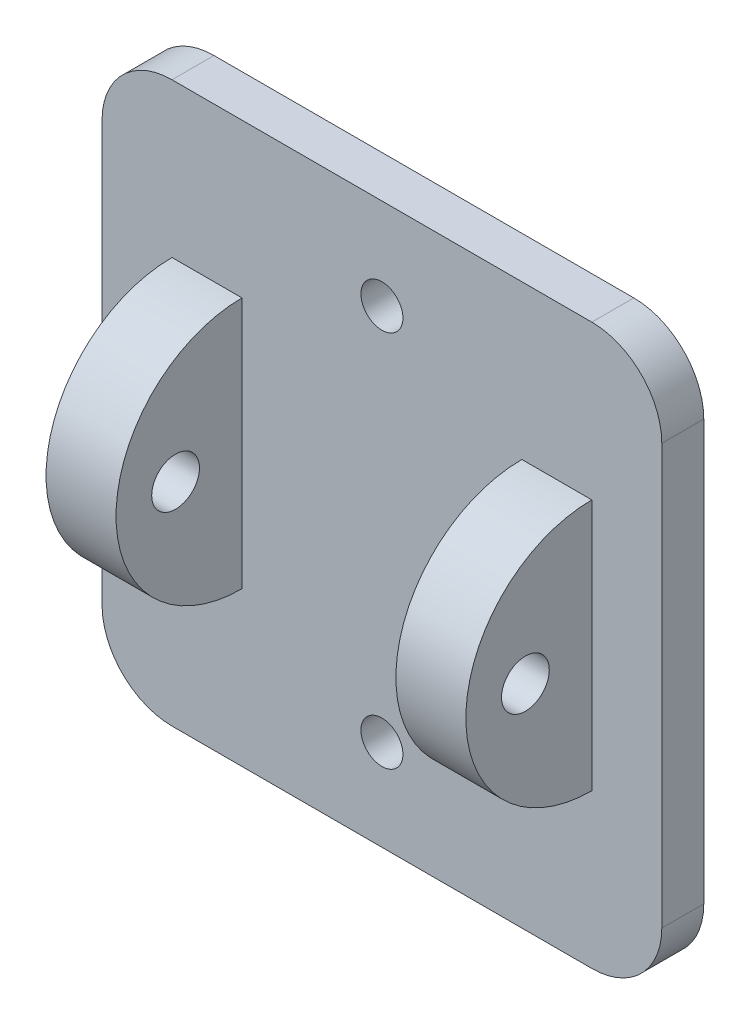
ISO-10303-21;
HEADER;
FILE_DESCRIPTION(('STEP AP214'),'2;1');
FILE_NAME('part.step','',(''),(''),'','','');
FILE_SCHEMA(('AUTOMOTIVE_DESIGN { 1 0 10303 214 1 1 1 1 }'));
ENDSEC;
DATA;
#1=APPLICATION_CONTEXT('core data for automotive mechanical design processes');
#2=APPLICATION_PROTOCOL_DEFINITION('international standard','automotive_design',2000,#1);
#3=PRODUCT_CONTEXT('',#1,'mechanical');
#4=PRODUCT('Part','Part','',(#3));
#5=PRODUCT_RELATED_PRODUCT_CATEGORY('part','',(#4));
#6=PRODUCT_DEFINITION_FORMATION('','',#4);
#7=PRODUCT_DEFINITION_CONTEXT('part definition',#1,'design');
#8=PRODUCT_DEFINITION('design','',#6,#7);
#9=PRODUCT_DEFINITION_SHAPE('','',#8);
#10=(LENGTH_UNIT() NAMED_UNIT(*) SI_UNIT(.MILLI.,.METRE.));
#11=(NAMED_UNIT(*) PLANE_ANGLE_UNIT() SI_UNIT($,.RADIAN.));
#12=(NAMED_UNIT(*) SI_UNIT($,.STERADIAN.) SOLID_ANGLE_UNIT());
#13=UNCERTAINTY_MEASURE_WITH_UNIT(LENGTH_MEASURE(1.E-05),#10,'distance_accuracy_value','');
#14=(GEOMETRIC_REPRESENTATION_CONTEXT(3) GLOBAL_UNCERTAINTY_ASSIGNED_CONTEXT((#13)) GLOBAL_UNIT_ASSIGNED_CONTEXT((#10,
#11,#12)) REPRESENTATION_CONTEXT('',''));
#15=CARTESIAN_POINT('',(0.,0.,0.));
#16=DIRECTION('',(0.,0.,1.));
#17=DIRECTION('',(1.,0.,0.));
#18=AXIS2_PLACEMENT_3D('',#15,#16,#17);
#19=CARTESIAN_POINT('',(22.3123663302852,-6.20192307692307,3.));
#20=DIRECTION('',(-1.,0.,0.));
#21=DIRECTION('',(0.,-1.,0.));
#22=AXIS2_PLACEMENT_3D('',#19,#20,#21);
#23=CYLINDRICAL_SURFACE('',#22,9.);
#24=DIRECTION('',(-1.,0.,0.));
#25=VECTOR('',#24,1.);
#26=CARTESIAN_POINT('',(-7.68763366971484,-15.2019230769231,3.));
#27=LINE('',#26,#25);
#28=CARTESIAN_POINT('',(22.3123663302852,-15.2019230769231,3.));
#29=VERTEX_POINT('',#28);
#30=CARTESIAN_POINT('',(17.3123663302852,-15.2019230769231,3.));
#31=VERTEX_POINT('',#30);
#32=EDGE_CURVE('E136',#29,#31,#27,.T.);
#33=ORIENTED_EDGE('',*,*,#32,.F.);
#34=CARTESIAN_POINT('',(22.3123663302852,-6.20192307692307,3.));
#35=DIRECTION('',(1.,0.,0.));
#36=DIRECTION('',(0.,0.,-1.));
#37=AXIS2_PLACEMENT_3D('',#34,#35,#36);
#38=CIRCLE('',#37,9.);
#39=CARTESIAN_POINT('',(22.3123663302852,2.79807692307693,3.));
#40=VERTEX_POINT('',#39);
#41=EDGE_CURVE('E50',#40,#29,#38,.T.);
#42=ORIENTED_EDGE('',*,*,#41,.F.);
#43=DIRECTION('',(1.,0.,0.));
#44=VECTOR('',#43,1.);
#45=CARTESIAN_POINT('',(-7.68763366971484,2.79807692307693,3.));
#46=LINE('',#45,#44);
#47=CARTESIAN_POINT('',(17.3123663302852,2.79807692307693,3.));
#48=VERTEX_POINT('',#47);
#49=EDGE_CURVE('E135',#48,#40,#46,.T.);
#50=ORIENTED_EDGE('',*,*,#49,.F.);
#51=CARTESIAN_POINT('',(17.3123663302852,-6.20192307692307,3.));
#52=DIRECTION('',(-1.,0.,0.));
#53=DIRECTION('',(0.,0.,1.));
#54=AXIS2_PLACEMENT_3D('',#51,#52,#53);
#55=CIRCLE('',#54,9.);
#56=EDGE_CURVE('E11',#31,#48,#55,.T.);
#57=ORIENTED_EDGE('',*,*,#56,.F.);
#58=EDGE_LOOP('',(#33,#42,#50,#57));
#59=FACE_BOUND('',#58,.T.);
#60=ADVANCED_FACE('F41',(#59),#23,.T.);
#61=CARTESIAN_POINT('',(-2.68763366971484,-6.20192307692307,3.));
#62=DIRECTION('',(-1.,0.,0.));
#63=DIRECTION('',(0.,0.,1.));
#64=AXIS2_PLACEMENT_3D('',#61,#62,#63);
#65=CYLINDRICAL_SURFACE('',#64,9.);
#66=DIRECTION('',(-1.,0.,0.));
#67=VECTOR('',#66,1.);
#68=CARTESIAN_POINT('',(-7.68763366971484,-15.2019230769231,3.));
#69=LINE('',#68,#67);
#70=CARTESIAN_POINT('',(-2.68763366971484,-15.2019230769231,3.));
#71=VERTEX_POINT('',#70);
#72=CARTESIAN_POINT('',(-7.68763366971484,-15.2019230769231,3.));
#73=VERTEX_POINT('',#72);
#74=EDGE_CURVE('E153',#71,#73,#69,.T.);
#75=ORIENTED_EDGE('',*,*,#74,.F.);
#76=CARTESIAN_POINT('',(-2.68763366971484,-6.20192307692307,3.));
#77=DIRECTION('',(1.,0.,0.));
#78=DIRECTION('',(0.,1.,0.));
#79=AXIS2_PLACEMENT_3D('',#76,#77,#78);
#80=CIRCLE('',#79,9.);
#81=CARTESIAN_POINT('',(-2.68763366971484,2.79807692307693,3.));
#82=VERTEX_POINT('',#81);
#83=EDGE_CURVE('E263',#82,#71,#80,.T.);
#84=ORIENTED_EDGE('',*,*,#83,.F.);
#85=DIRECTION('',(1.,0.,0.));
#86=VECTOR('',#85,1.);
#87=CARTESIAN_POINT('',(-7.68763366971484,2.79807692307693,3.));
#88=LINE('',#87,#86);
#89=CARTESIAN_POINT('',(-7.68763366971484,2.79807692307693,3.));
#90=VERTEX_POINT('',#89);
#91=EDGE_CURVE('E161',#90,#82,#88,.T.);
#92=ORIENTED_EDGE('',*,*,#91,.F.);
#93=CARTESIAN_POINT('',(-7.68763366971484,-6.20192307692307,3.));
#94=DIRECTION('',(-1.,0.,0.));
#95=DIRECTION('',(0.,-1.,0.));
#96=AXIS2_PLACEMENT_3D('',#93,#94,#95);
#97=CIRCLE('',#96,9.);
#98=EDGE_CURVE('E266',#73,#90,#97,.T.);
#99=ORIENTED_EDGE('',*,*,#98,.F.);
#100=EDGE_LOOP('',(#75,#84,#92,#99));
#101=FACE_BOUND('',#100,.T.);
#102=ADVANCED_FACE('F275',(#101),#65,.T.);
#103=CARTESIAN_POINT('',(-7.68763366971484,-21.2019230769231,3.));
#104=DIRECTION('',(0.,0.,1.));
#105=DIRECTION('',(1.,0.,0.));
#106=AXIS2_PLACEMENT_3D('',#103,#104,#105);
#107=PLANE('',#106);
#108=DIRECTION('',(0.,1.,0.));
#109=VECTOR('',#108,1.);
#110=CARTESIAN_POINT('',(17.3123663302852,-21.2019230769231,3.));
#111=LINE('',#110,#109);
#112=EDGE_CURVE('E130',#31,#48,#111,.T.);
#113=ORIENTED_EDGE('',*,*,#112,.T.);
#114=ORIENTED_EDGE('',*,*,#49,.T.);
#115=DIRECTION('',(0.,-1.,0.));
#116=VECTOR('',#115,1.);
#117=CARTESIAN_POINT('',(22.3123663302852,-21.2019230769231,3.));
#118=LINE('',#117,#116);
#119=EDGE_CURVE('E141',#40,#29,#118,.T.);
#120=ORIENTED_EDGE('',*,*,#119,.T.);
#121=ORIENTED_EDGE('',*,*,#32,.T.);
#122=EDGE_LOOP('',(#113,#114,#120,#121));
#123=FACE_BOUND('',#122,.T.);
#124=CARTESIAN_POINT('',(7.31236633028516,7.29807692307693,3.));
#125=DIRECTION('',(0.,0.,1.));
#126=DIRECTION('',(1.,0.,0.));
#127=AXIS2_PLACEMENT_3D('',#124,#125,#126);
#128=CIRCLE('',#127,1.5);
#129=CARTESIAN_POINT('',(8.81236633028516,7.29807692307693,3.));
#130=VERTEX_POINT('',#129);
#131=EDGE_CURVE('E174',#130,#130,#128,.T.);
#132=ORIENTED_EDGE('',*,*,#131,.F.);
#133=EDGE_LOOP('',(#132));
#134=FACE_BOUND('',#133,.T.);
#135=CARTESIAN_POINT('',(-7.68763366971484,-21.2019230769231,3.));
#136=DIRECTION('',(0.,0.,1.));
#137=DIRECTION('',(1.,0.,0.));
#138=AXIS2_PLACEMENT_3D('',#135,#136,#137);
#139=CIRCLE('',#138,5.);
#140=CARTESIAN_POINT('',(-12.6876336697148,-21.2019230769231,3.));
#141=VERTEX_POINT('',#140);
#142=CARTESIAN_POINT('',(-7.68763366971484,-26.2019230769231,3.));
#143=VERTEX_POINT('',#142);
#144=EDGE_CURVE('E182',#141,#143,#139,.T.);
#145=ORIENTED_EDGE('',*,*,#144,.T.);
#146=DIRECTION('',(1.,0.,0.));
#147=VECTOR('',#146,1.);
#148=CARTESIAN_POINT('',(-7.68763366971484,-26.2019230769231,3.));
#149=LINE('',#148,#147);
#150=CARTESIAN_POINT('',(22.3123663302852,-26.2019230769231,3.));
#151=VERTEX_POINT('',#150);
#152=EDGE_CURVE('E186',#143,#151,#149,.T.);
#153=ORIENTED_EDGE('',*,*,#152,.T.);
#154=CARTESIAN_POINT('',(22.3123663302852,-21.2019230769231,3.));
#155=DIRECTION('',(0.,0.,1.));
#156=DIRECTION('',(1.,0.,0.));
#157=AXIS2_PLACEMENT_3D('',#154,#155,#156);
#158=CIRCLE('',#157,5.);
#159=CARTESIAN_POINT('',(27.3123663302852,-21.2019230769231,3.));
#160=VERTEX_POINT('',#159);
#161=EDGE_CURVE('E190',#151,#160,#158,.T.);
#162=ORIENTED_EDGE('',*,*,#161,.T.);
#163=DIRECTION('',(0.,1.,0.));
#164=VECTOR('',#163,1.);
#165=CARTESIAN_POINT('',(27.3123663302852,8.79807692307693,3.));
#166=LINE('',#165,#164);
#167=CARTESIAN_POINT('',(27.3123663302852,8.79807692307694,3.));
#168=VERTEX_POINT('',#167);
#169=EDGE_CURVE('E193',#160,#168,#166,.T.);
#170=ORIENTED_EDGE('',*,*,#169,.T.);
#171=CARTESIAN_POINT('',(22.3123663302852,8.79807692307693,3.));
#172=DIRECTION('',(0.,0.,1.));
#173=DIRECTION('',(-1.,0.,0.));
#174=AXIS2_PLACEMENT_3D('',#171,#172,#173);
#175=CIRCLE('',#174,5.);
#176=CARTESIAN_POINT('',(22.3123663302852,13.7980769230769,3.));
#177=VERTEX_POINT('',#176);
#178=EDGE_CURVE('E196',#168,#177,#175,.T.);
#179=ORIENTED_EDGE('',*,*,#178,.T.);
#180=DIRECTION('',(-1.,0.,0.));
#181=VECTOR('',#180,1.);
#182=CARTESIAN_POINT('',(-7.68763366971484,13.7980769230769,3.));
#183=LINE('',#182,#181);
#184=CARTESIAN_POINT('',(-7.68763366971484,13.7980769230769,3.));
#185=VERTEX_POINT('',#184);
#186=EDGE_CURVE('E199',#177,#185,#183,.T.);
#187=ORIENTED_EDGE('',*,*,#186,.T.);
#188=CARTESIAN_POINT('',(-7.68763366971484,8.79807692307693,3.));
#189=DIRECTION('',(0.,0.,1.));
#190=DIRECTION('',(1.,0.,0.));
#191=AXIS2_PLACEMENT_3D('',#188,#189,#190);
#192=CIRCLE('',#191,5.);
#193=CARTESIAN_POINT('',(-12.6876336697148,8.79807692307693,3.));
#194=VERTEX_POINT('',#193);
#195=EDGE_CURVE('E202',#185,#194,#192,.T.);
#196=ORIENTED_EDGE('',*,*,#195,.T.);
#197=DIRECTION('',(0.,-1.,0.));
#198=VECTOR('',#197,1.);
#199=CARTESIAN_POINT('',(-12.6876336697148,8.79807692307693,3.));
#200=LINE('',#199,#198);
#201=EDGE_CURVE('E205',#194,#141,#200,.T.);
#202=ORIENTED_EDGE('',*,*,#201,.T.);
#203=EDGE_LOOP('',(#145,#153,#162,#170,#179,#187,#196,#202));
#204=FACE_BOUND('',#203,.T.);
#205=CARTESIAN_POINT('',(7.31236633028516,-19.7019230769231,3.));
#206=DIRECTION('',(0.,0.,1.));
#207=DIRECTION('',(1.,0.,0.));
#208=AXIS2_PLACEMENT_3D('',#205,#206,#207);
#209=CIRCLE('',#208,1.5);
#210=CARTESIAN_POINT('',(8.81236633028517,-19.7019230769231,3.));
#211=VERTEX_POINT('',#210);
#212=EDGE_CURVE('E166',#211,#211,#209,.T.);
#213=ORIENTED_EDGE('',*,*,#212,.F.);
#214=EDGE_LOOP('',(#213));
#215=FACE_BOUND('',#214,.T.);
#216=ORIENTED_EDGE('',*,*,#91,.T.);
#217=DIRECTION('',(0.,-1.,0.));
#218=VECTOR('',#217,1.);
#219=CARTESIAN_POINT('',(-2.68763366971484,-21.2019230769231,3.));
#220=LINE('',#219,#218);
#221=EDGE_CURVE('E149',#82,#71,#220,.T.);
#222=ORIENTED_EDGE('',*,*,#221,.T.);
#223=ORIENTED_EDGE('',*,*,#74,.T.);
#224=DIRECTION('',(0.,1.,0.));
#225=VECTOR('',#224,1.);
#226=CARTESIAN_POINT('',(-7.68763366971484,-21.2019230769231,3.));
#227=LINE('',#226,#225);
#228=EDGE_CURVE('E157',#73,#90,#227,.T.);
#229=ORIENTED_EDGE('',*,*,#228,.T.);
#230=EDGE_LOOP('',(#216,#222,#223,#229));
#231=FACE_BOUND('',#230,.T.);
#232=ADVANCED_FACE('F133',(#123,#134,#204,#215,#231),#107,.T.);
#233=CARTESIAN_POINT('',(-7.68763366971484,-21.2019230769231,0.));
#234=DIRECTION('',(0.,0.,1.));
#235=DIRECTION('',(1.,0.,0.));
#236=AXIS2_PLACEMENT_3D('',#233,#234,#235);
#237=PLANE('',#236);
#238=CARTESIAN_POINT('',(-7.68763366971484,-21.2019230769231,0.));
#239=DIRECTION('',(0.,0.,1.));
#240=DIRECTION('',(1.,0.,0.));
#241=AXIS2_PLACEMENT_3D('',#238,#239,#240);
#242=CIRCLE('',#241,5.);
#243=CARTESIAN_POINT('',(-12.6876336697148,-21.2019230769231,0.));
#244=VERTEX_POINT('',#243);
#245=CARTESIAN_POINT('',(-7.68763366971484,-26.2019230769231,0.));
#246=VERTEX_POINT('',#245);
#247=EDGE_CURVE('E178',#244,#246,#242,.T.);
#248=ORIENTED_EDGE('',*,*,#247,.F.);
#249=DIRECTION('',(0.,-1.,0.));
#250=VECTOR('',#249,1.);
#251=CARTESIAN_POINT('',(-12.6876336697148,8.79807692307693,0.));
#252=LINE('',#251,#250);
#253=CARTESIAN_POINT('',(-12.6876336697148,8.79807692307693,0.));
#254=VERTEX_POINT('',#253);
#255=EDGE_CURVE('E187',#254,#244,#252,.T.);
#256=ORIENTED_EDGE('',*,*,#255,.F.);
#257=CARTESIAN_POINT('',(-7.68763366971484,8.79807692307693,0.));
#258=DIRECTION('',(0.,0.,1.));
#259=DIRECTION('',(1.,0.,0.));
#260=AXIS2_PLACEMENT_3D('',#257,#258,#259);
#261=CIRCLE('',#260,5.);
#262=CARTESIAN_POINT('',(-7.68763366971484,13.7980769230769,0.));
#263=VERTEX_POINT('',#262);
#264=EDGE_CURVE('E227',#263,#254,#261,.T.);
#265=ORIENTED_EDGE('',*,*,#264,.F.);
#266=DIRECTION('',(-1.,0.,0.));
#267=VECTOR('',#266,1.);
#268=CARTESIAN_POINT('',(-7.68763366971484,13.7980769230769,0.));
#269=LINE('',#268,#267);
#270=CARTESIAN_POINT('',(22.3123663302852,13.7980769230769,0.));
#271=VERTEX_POINT('',#270);
#272=EDGE_CURVE('E224',#271,#263,#269,.T.);
#273=ORIENTED_EDGE('',*,*,#272,.F.);
#274=CARTESIAN_POINT('',(22.3123663302852,8.79807692307693,0.));
#275=DIRECTION('',(0.,0.,1.));
#276=DIRECTION('',(-1.,0.,0.));
#277=AXIS2_PLACEMENT_3D('',#274,#275,#276);
#278=CIRCLE('',#277,5.);
#279=CARTESIAN_POINT('',(27.3123663302852,8.79807692307694,0.));
#280=VERTEX_POINT('',#279);
#281=EDGE_CURVE('E221',#280,#271,#278,.T.);
#282=ORIENTED_EDGE('',*,*,#281,.F.);
#283=DIRECTION('',(0.,1.,0.));
#284=VECTOR('',#283,1.);
#285=CARTESIAN_POINT('',(27.3123663302852,8.79807692307693,0.));
#286=LINE('',#285,#284);
#287=CARTESIAN_POINT('',(27.3123663302852,-21.2019230769231,0.));
#288=VERTEX_POINT('',#287);
#289=EDGE_CURVE('E218',#288,#280,#286,.T.);
#290=ORIENTED_EDGE('',*,*,#289,.F.);
#291=CARTESIAN_POINT('',(22.3123663302852,-21.2019230769231,0.));
#292=DIRECTION('',(0.,0.,1.));
#293=DIRECTION('',(1.,0.,0.));
#294=AXIS2_PLACEMENT_3D('',#291,#292,#293);
#295=CIRCLE('',#294,5.);
#296=CARTESIAN_POINT('',(22.3123663302852,-26.2019230769231,0.));
#297=VERTEX_POINT('',#296);
#298=EDGE_CURVE('E215',#297,#288,#295,.T.);
#299=ORIENTED_EDGE('',*,*,#298,.F.);
#300=DIRECTION('',(1.,0.,0.));
#301=VECTOR('',#300,1.);
#302=CARTESIAN_POINT('',(-7.68763366971484,-26.2019230769231,0.));
#303=LINE('',#302,#301);
#304=EDGE_CURVE('E212',#246,#297,#303,.T.);
#305=ORIENTED_EDGE('',*,*,#304,.F.);
#306=EDGE_LOOP('',(#248,#256,#265,#273,#282,#290,#299,#305));
#307=FACE_BOUND('',#306,.T.);
#308=CARTESIAN_POINT('',(7.31236633028516,7.29807692307693,0.));
#309=DIRECTION('',(0.,0.,1.));
#310=DIRECTION('',(1.,0.,0.));
#311=AXIS2_PLACEMENT_3D('',#308,#309,#310);
#312=CIRCLE('',#311,1.5);
#313=CARTESIAN_POINT('',(8.81236633028516,7.29807692307693,0.));
#314=VERTEX_POINT('',#313);
#315=EDGE_CURVE('E170',#314,#314,#312,.T.);
#316=ORIENTED_EDGE('',*,*,#315,.T.);
#317=EDGE_LOOP('',(#316));
#318=FACE_BOUND('',#317,.T.);
#319=CARTESIAN_POINT('',(7.31236633028516,-19.7019230769231,0.));
#320=DIRECTION('',(0.,0.,1.));
#321=DIRECTION('',(1.,0.,0.));
#322=AXIS2_PLACEMENT_3D('',#319,#320,#321);
#323=CIRCLE('',#322,1.5);
#324=CARTESIAN_POINT('',(8.81236633028517,-19.7019230769231,0.));
#325=VERTEX_POINT('',#324);
#326=EDGE_CURVE('E165',#325,#325,#323,.T.);
#327=ORIENTED_EDGE('',*,*,#326,.T.);
#328=EDGE_LOOP('',(#327));
#329=FACE_BOUND('',#328,.T.);
#330=ADVANCED_FACE('F301',(#307,#318,#329),#237,.F.);
#331=CARTESIAN_POINT('',(-7.68763366971484,-21.2019230769231,3.));
#332=DIRECTION('',(0.,0.,-1.));
#333=DIRECTION('',(-1.,0.,0.));
#334=AXIS2_PLACEMENT_3D('',#331,#332,#333);
#335=CYLINDRICAL_SURFACE('',#334,5.);
#336=ORIENTED_EDGE('',*,*,#247,.T.);
#337=DIRECTION('',(0.,0.,-1.));
#338=VECTOR('',#337,1.);
#339=CARTESIAN_POINT('',(-7.68763366971484,-26.2019230769231,3.));
#340=LINE('',#339,#338);
#341=EDGE_CURVE('E259',#143,#246,#340,.T.);
#342=ORIENTED_EDGE('',*,*,#341,.F.);
#343=ORIENTED_EDGE('',*,*,#144,.F.);
#344=DIRECTION('',(0.,0.,-1.));
#345=VECTOR('',#344,1.);
#346=CARTESIAN_POINT('',(-12.6876336697148,-21.2019230769231,3.));
#347=LINE('',#346,#345);
#348=EDGE_CURVE('E208',#141,#244,#347,.T.);
#349=ORIENTED_EDGE('',*,*,#348,.T.);
#350=EDGE_LOOP('',(#336,#342,#343,#349));
#351=FACE_BOUND('',#350,.T.);
#352=ADVANCED_FACE('F307',(#351),#335,.T.);
#353=CARTESIAN_POINT('',(-7.68763366971484,-26.2019230769231,3.));
#354=DIRECTION('',(0.,1.,0.));
#355=DIRECTION('',(-1.,0.,0.));
#356=AXIS2_PLACEMENT_3D('',#353,#354,#355);
#357=PLANE('',#356);
#358=ORIENTED_EDGE('',*,*,#304,.T.);
#359=DIRECTION('',(0.,0.,-1.));
#360=VECTOR('',#359,1.);
#361=CARTESIAN_POINT('',(22.3123663302852,-26.2019230769231,3.));
#362=LINE('',#361,#360);
#363=EDGE_CURVE('E255',#151,#297,#362,.T.);
#364=ORIENTED_EDGE('',*,*,#363,.F.);
#365=ORIENTED_EDGE('',*,*,#152,.F.);
#366=ORIENTED_EDGE('',*,*,#341,.T.);
#367=EDGE_LOOP('',(#358,#364,#365,#366));
#368=FACE_BOUND('',#367,.T.);
#369=ADVANCED_FACE('F310',(#368),#357,.F.);
#370=CARTESIAN_POINT('',(22.3123663302852,-21.2019230769231,3.));
#371=DIRECTION('',(0.,0.,-1.));
#372=DIRECTION('',(-1.,0.,0.));
#373=AXIS2_PLACEMENT_3D('',#370,#371,#372);
#374=CYLINDRICAL_SURFACE('',#373,5.);
#375=ORIENTED_EDGE('',*,*,#298,.T.);
#376=DIRECTION('',(0.,0.,-1.));
#377=VECTOR('',#376,1.);
#378=CARTESIAN_POINT('',(27.3123663302852,-21.2019230769231,3.));
#379=LINE('',#378,#377);
#380=EDGE_CURVE('E251',#160,#288,#379,.T.);
#381=ORIENTED_EDGE('',*,*,#380,.F.);
#382=ORIENTED_EDGE('',*,*,#161,.F.);
#383=ORIENTED_EDGE('',*,*,#363,.T.);
#384=EDGE_LOOP('',(#375,#381,#382,#383));
#385=FACE_BOUND('',#384,.T.);
#386=ADVANCED_FACE('F314',(#385),#374,.T.);
#387=CARTESIAN_POINT('',(27.3123663302852,8.79807692307693,3.));
#388=DIRECTION('',(-1.,0.,0.));
#389=DIRECTION('',(0.,0.,1.));
#390=AXIS2_PLACEMENT_3D('',#387,#388,#389);
#391=PLANE('',#390);
#392=ORIENTED_EDGE('',*,*,#289,.T.);
#393=DIRECTION('',(0.,0.,-1.));
#394=VECTOR('',#393,1.);
#395=CARTESIAN_POINT('',(27.3123663302852,8.79807692307694,3.));
#396=LINE('',#395,#394);
#397=EDGE_CURVE('E247',#168,#280,#396,.T.);
#398=ORIENTED_EDGE('',*,*,#397,.F.);
#399=ORIENTED_EDGE('',*,*,#169,.F.);
#400=ORIENTED_EDGE('',*,*,#380,.T.);
#401=EDGE_LOOP('',(#392,#398,#399,#400));
#402=FACE_BOUND('',#401,.T.);
#403=ADVANCED_FACE('F318',(#402),#391,.F.);
#404=CARTESIAN_POINT('',(22.3123663302852,8.79807692307693,3.));
#405=DIRECTION('',(0.,0.,-1.));
#406=DIRECTION('',(-1.,0.,0.));
#407=AXIS2_PLACEMENT_3D('',#404,#405,#406);
#408=CYLINDRICAL_SURFACE('',#407,5.);
#409=ORIENTED_EDGE('',*,*,#281,.T.);
#410=DIRECTION('',(0.,0.,-1.));
#411=VECTOR('',#410,1.);
#412=CARTESIAN_POINT('',(22.3123663302852,13.7980769230769,3.));
#413=LINE('',#412,#411);
#414=EDGE_CURVE('E243',#177,#271,#413,.T.);
#415=ORIENTED_EDGE('',*,*,#414,.F.);
#416=ORIENTED_EDGE('',*,*,#178,.F.);
#417=ORIENTED_EDGE('',*,*,#397,.T.);
#418=EDGE_LOOP('',(#409,#415,#416,#417));
#419=FACE_BOUND('',#418,.T.);
#420=ADVANCED_FACE('F322',(#419),#408,.T.);
#421=CARTESIAN_POINT('',(-7.68763366971484,13.7980769230769,3.));
#422=DIRECTION('',(0.,-1.,0.));
#423=DIRECTION('',(1.,0.,0.));
#424=AXIS2_PLACEMENT_3D('',#421,#422,#423);
#425=PLANE('',#424);
#426=ORIENTED_EDGE('',*,*,#272,.T.);
#427=DIRECTION('',(0.,0.,-1.));
#428=VECTOR('',#427,1.);
#429=CARTESIAN_POINT('',(-7.68763366971484,13.7980769230769,3.));
#430=LINE('',#429,#428);
#431=EDGE_CURVE('E239',#185,#263,#430,.T.);
#432=ORIENTED_EDGE('',*,*,#431,.F.);
#433=ORIENTED_EDGE('',*,*,#186,.F.);
#434=ORIENTED_EDGE('',*,*,#414,.T.);
#435=EDGE_LOOP('',(#426,#432,#433,#434));
#436=FACE_BOUND('',#435,.T.);
#437=ADVANCED_FACE('F326',(#436),#425,.F.);
#438=CARTESIAN_POINT('',(-7.68763366971484,8.79807692307693,3.));
#439=DIRECTION('',(0.,0.,-1.));
#440=DIRECTION('',(-1.,0.,0.));
#441=AXIS2_PLACEMENT_3D('',#438,#439,#440);
#442=CYLINDRICAL_SURFACE('',#441,5.);
#443=ORIENTED_EDGE('',*,*,#264,.T.);
#444=DIRECTION('',(0.,0.,-1.));
#445=VECTOR('',#444,1.);
#446=CARTESIAN_POINT('',(-12.6876336697148,8.79807692307693,3.));
#447=LINE('',#446,#445);
#448=EDGE_CURVE('E235',#194,#254,#447,.T.);
#449=ORIENTED_EDGE('',*,*,#448,.F.);
#450=ORIENTED_EDGE('',*,*,#195,.F.);
#451=ORIENTED_EDGE('',*,*,#431,.T.);
#452=EDGE_LOOP('',(#443,#449,#450,#451));
#453=FACE_BOUND('',#452,.T.);
#454=ADVANCED_FACE('F330',(#453),#442,.T.);
#455=CARTESIAN_POINT('',(-12.6876336697148,8.79807692307693,3.));
#456=DIRECTION('',(1.,0.,0.));
#457=DIRECTION('',(0.,1.,0.));
#458=AXIS2_PLACEMENT_3D('',#455,#456,#457);
#459=PLANE('',#458);
#460=ORIENTED_EDGE('',*,*,#255,.T.);
#461=ORIENTED_EDGE('',*,*,#348,.F.);
#462=ORIENTED_EDGE('',*,*,#201,.F.);
#463=ORIENTED_EDGE('',*,*,#448,.T.);
#464=EDGE_LOOP('',(#460,#461,#462,#463));
#465=FACE_BOUND('',#464,.T.);
#466=ADVANCED_FACE('F334',(#465),#459,.F.);
#467=CARTESIAN_POINT('',(7.31236633028516,7.29807692307693,3.));
#468=DIRECTION('',(0.,0.,-1.));
#469=DIRECTION('',(-1.,0.,0.));
#470=AXIS2_PLACEMENT_3D('',#467,#468,#469);
#471=CYLINDRICAL_SURFACE('',#470,1.5);
#472=ORIENTED_EDGE('',*,*,#131,.T.);
#473=EDGE_LOOP('',(#472));
#474=FACE_BOUND('',#473,.T.);
#475=ORIENTED_EDGE('',*,*,#315,.F.);
#476=EDGE_LOOP('',(#475));
#477=FACE_BOUND('',#476,.T.);
#478=ADVANCED_FACE('F290',(#474,#477),#471,.F.);
#479=CARTESIAN_POINT('',(7.31236633028516,-19.7019230769231,3.));
#480=DIRECTION('',(0.,0.,-1.));
#481=DIRECTION('',(-1.,0.,0.));
#482=AXIS2_PLACEMENT_3D('',#479,#480,#481);
#483=CYLINDRICAL_SURFACE('',#482,1.5);
#484=ORIENTED_EDGE('',*,*,#212,.T.);
#485=EDGE_LOOP('',(#484));
#486=FACE_BOUND('',#485,.T.);
#487=ORIENTED_EDGE('',*,*,#326,.F.);
#488=EDGE_LOOP('',(#487));
#489=FACE_BOUND('',#488,.T.);
#490=ADVANCED_FACE('F281',(#486,#489),#483,.F.);
#491=CARTESIAN_POINT('',(-2.68763366971484,-21.2019230769231,12.));
#492=DIRECTION('',(1.,0.,0.));
#493=DIRECTION('',(0.,1.,0.));
#494=AXIS2_PLACEMENT_3D('',#491,#492,#493);
#495=PLANE('',#494);
#496=CARTESIAN_POINT('',(-2.68763366971484,-6.20192307692307,7.74625312));
#497=DIRECTION('',(1.,0.,0.));
#498=DIRECTION('',(0.,1.,0.));
#499=AXIS2_PLACEMENT_3D('',#496,#497,#498);
#500=CIRCLE('',#499,1.70555965287615);
#501=CARTESIAN_POINT('',(-2.68763366971484,-4.49636342404692,7.74625312));
#502=VERTEX_POINT('',#501);
#503=EDGE_CURVE('E138',#502,#502,#500,.T.);
#504=ORIENTED_EDGE('',*,*,#503,.F.);
#505=EDGE_LOOP('',(#504));
#506=FACE_BOUND('',#505,.T.);
#507=ORIENTED_EDGE('',*,*,#221,.F.);
#508=ORIENTED_EDGE('',*,*,#83,.T.);
#509=EDGE_LOOP('',(#507,#508));
#510=FACE_BOUND('',#509,.T.);
#511=ADVANCED_FACE('F279',(#506,#510),#495,.T.);
#512=CARTESIAN_POINT('',(-7.68763366971484,-21.2019230769231,12.));
#513=DIRECTION('',(-1.,0.,0.));
#514=DIRECTION('',(0.,-1.,0.));
#515=AXIS2_PLACEMENT_3D('',#512,#513,#514);
#516=PLANE('',#515);
#517=CARTESIAN_POINT('',(-7.68763366971484,-6.20192307692307,7.74625312));
#518=DIRECTION('',(-1.,0.,0.));
#519=DIRECTION('',(0.,-1.,0.));
#520=AXIS2_PLACEMENT_3D('',#517,#518,#519);
#521=CIRCLE('',#520,1.70555965287615);
#522=CARTESIAN_POINT('',(-7.68763366971484,-7.90748272979922,7.74625312));
#523=VERTEX_POINT('',#522);
#524=EDGE_CURVE('E454',#523,#523,#521,.T.);
#525=ORIENTED_EDGE('',*,*,#524,.F.);
#526=EDGE_LOOP('',(#525));
#527=FACE_BOUND('',#526,.T.);
#528=ORIENTED_EDGE('',*,*,#228,.F.);
#529=ORIENTED_EDGE('',*,*,#98,.T.);
#530=EDGE_LOOP('',(#528,#529));
#531=FACE_BOUND('',#530,.T.);
#532=ADVANCED_FACE('F272',(#527,#531),#516,.T.);
#533=CARTESIAN_POINT('',(17.3123663302852,-21.2019230769231,12.));
#534=DIRECTION('',(-1.,0.,0.));
#535=DIRECTION('',(0.,0.,1.));
#536=AXIS2_PLACEMENT_3D('',#533,#534,#535);
#537=PLANE('',#536);
#538=CARTESIAN_POINT('',(17.3123663302852,-6.20192307692307,7.74625312));
#539=DIRECTION('',(-1.,0.,0.));
#540=DIRECTION('',(0.,0.,1.));
#541=AXIS2_PLACEMENT_3D('',#538,#539,#540);
#542=CIRCLE('',#541,1.70555965287615);
#543=CARTESIAN_POINT('',(17.3123663302852,-6.20192307692307,9.45181277287615));
#544=VERTEX_POINT('',#543);
#545=EDGE_CURVE('E460',#544,#544,#542,.T.);
#546=ORIENTED_EDGE('',*,*,#545,.F.);
#547=EDGE_LOOP('',(#546));
#548=FACE_BOUND('',#547,.T.);
#549=ORIENTED_EDGE('',*,*,#112,.F.);
#550=ORIENTED_EDGE('',*,*,#56,.T.);
#551=EDGE_LOOP('',(#549,#550));
#552=FACE_BOUND('',#551,.T.);
#553=ADVANCED_FACE('F129',(#548,#552),#537,.T.);
#554=CARTESIAN_POINT('',(22.3123663302852,-21.2019230769231,12.));
#555=DIRECTION('',(1.,0.,0.));
#556=DIRECTION('',(0.,0.,-1.));
#557=AXIS2_PLACEMENT_3D('',#554,#555,#556);
#558=PLANE('',#557);
#559=CARTESIAN_POINT('',(22.3123663302852,-6.20192307692307,7.74625312));
#560=DIRECTION('',(1.,0.,0.));
#561=DIRECTION('',(0.,0.,-1.));
#562=AXIS2_PLACEMENT_3D('',#559,#560,#561);
#563=CIRCLE('',#562,1.70555965287615);
#564=CARTESIAN_POINT('',(22.3123663302852,-6.20192307692307,6.04069346712385));
#565=VERTEX_POINT('',#564);
#566=EDGE_CURVE('E456',#565,#565,#563,.F.);
#567=ORIENTED_EDGE('',*,*,#566,.T.);
#568=EDGE_LOOP('',(#567));
#569=FACE_BOUND('',#568,.T.);
#570=ORIENTED_EDGE('',*,*,#119,.F.);
#571=ORIENTED_EDGE('',*,*,#41,.T.);
#572=EDGE_LOOP('',(#570,#571));
#573=FACE_BOUND('',#572,.T.);
#574=ADVANCED_FACE('F419',(#569,#573),#558,.T.);
#575=CARTESIAN_POINT('',(27.1364175153528,-6.20192307692306,7.74625312));
#576=DIRECTION('',(-1.,0.,0.));
#577=DIRECTION('',(0.,-1.,0.));
#578=AXIS2_PLACEMENT_3D('',#575,#576,#577);
#579=CYLINDRICAL_SURFACE('',#578,1.70555965287615);
#580=ORIENTED_EDGE('',*,*,#545,.T.);
#581=EDGE_LOOP('',(#580));
#582=FACE_BOUND('',#581,.T.);
#583=ORIENTED_EDGE('',*,*,#566,.F.);
#584=EDGE_LOOP('',(#583));
#585=FACE_BOUND('',#584,.T.);
#586=ADVANCED_FACE('F428',(#582,#585),#579,.F.);
#587=ORIENTED_EDGE('',*,*,#503,.T.);
#588=EDGE_LOOP('',(#587));
#589=FACE_BOUND('',#588,.T.);
#590=ORIENTED_EDGE('',*,*,#524,.T.);
#591=EDGE_LOOP('',(#590));
#592=FACE_BOUND('',#591,.T.);
#593=ADVANCED_FACE('F437',(#589,#592),#579,.F.);
#594=CLOSED_SHELL('',(#60,#102,#232,#330,#352,#369,#386,#403,#420,#437,#454,#466,#478,#490,#511,
#532,#553,#574,#586,#593));
#595=MANIFOLD_SOLID_BREP('B2',#594);
#596=ADVANCED_BREP_SHAPE_REPRESENTATION('',(#18,#595),#14);
#597=SHAPE_DEFINITION_REPRESENTATION(#9,#596);
ENDSEC;
END-ISO-10303-21;
